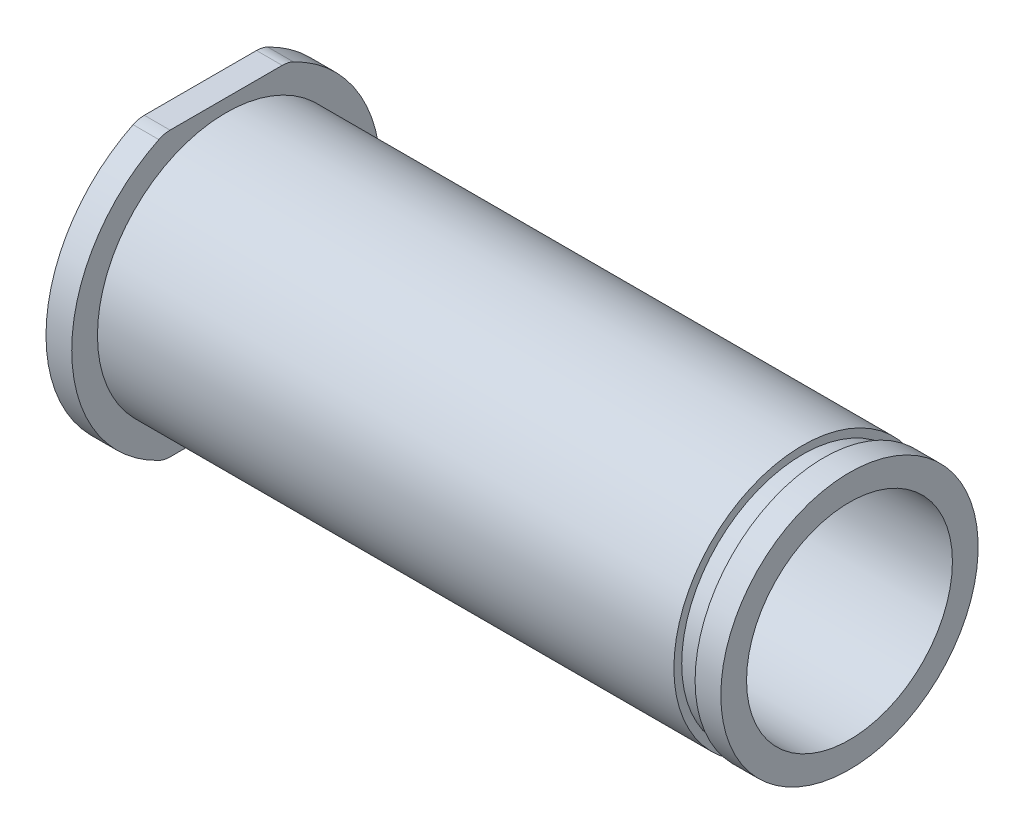
ISO-10303-21;
HEADER;
FILE_DESCRIPTION(('STEP AP214'),'2;1');
FILE_NAME('part.step','',(''),(''),'','','');
FILE_SCHEMA(('AUTOMOTIVE_DESIGN { 1 0 10303 214 1 1 1 1 }'));
ENDSEC;
DATA;
#1=APPLICATION_CONTEXT('core data for automotive mechanical design processes');
#2=APPLICATION_PROTOCOL_DEFINITION('international standard','automotive_design',2000,#1);
#3=PRODUCT_CONTEXT('',#1,'mechanical');
#4=PRODUCT('Part','Part','',(#3));
#5=PRODUCT_RELATED_PRODUCT_CATEGORY('part','',(#4));
#6=PRODUCT_DEFINITION_FORMATION('','',#4);
#7=PRODUCT_DEFINITION_CONTEXT('part definition',#1,'design');
#8=PRODUCT_DEFINITION('design','',#6,#7);
#9=PRODUCT_DEFINITION_SHAPE('','',#8);
#10=(LENGTH_UNIT() NAMED_UNIT(*) SI_UNIT(.MILLI.,.METRE.));
#11=(NAMED_UNIT(*) PLANE_ANGLE_UNIT() SI_UNIT($,.RADIAN.));
#12=(NAMED_UNIT(*) SI_UNIT($,.STERADIAN.) SOLID_ANGLE_UNIT());
#13=UNCERTAINTY_MEASURE_WITH_UNIT(LENGTH_MEASURE(1.E-05),#10,'distance_accuracy_value','');
#14=(GEOMETRIC_REPRESENTATION_CONTEXT(3) GLOBAL_UNCERTAINTY_ASSIGNED_CONTEXT((#13)) GLOBAL_UNIT_ASSIGNED_CONTEXT((#10,
#11,#12)) REPRESENTATION_CONTEXT('',''));
#15=CARTESIAN_POINT('',(0.,0.,0.));
#16=DIRECTION('',(0.,0.,1.));
#17=DIRECTION('',(1.,0.,0.));
#18=AXIS2_PLACEMENT_3D('',#15,#16,#17);
#19=CARTESIAN_POINT('',(0.,0.,0.));
#20=DIRECTION('',(-1.,0.,0.));
#21=DIRECTION('',(0.,0.,1.));
#22=AXIS2_PLACEMENT_3D('',#19,#20,#21);
#23=CYLINDRICAL_SURFACE('',#22,19.05);
#24=CARTESIAN_POINT('',(0.,0.,0.));
#25=DIRECTION('',(-1.,0.,0.));
#26=DIRECTION('',(0.,0.,1.));
#27=AXIS2_PLACEMENT_3D('',#24,#25,#26);
#28=CIRCLE('',#27,19.05);
#29=CARTESIAN_POINT('',(0.,-17.145,8.303702487445));
#30=VERTEX_POINT('',#29);
#31=CARTESIAN_POINT('',(0.,17.145,8.303702487445));
#32=VERTEX_POINT('',#31);
#33=EDGE_CURVE('E175',#30,#32,#28,.T.);
#34=ORIENTED_EDGE('',*,*,#33,.F.);
#35=DIRECTION('',(-1.,0.,0.));
#36=VECTOR('',#35,1.);
#37=CARTESIAN_POINT('',(0.,-17.145,8.303702487445));
#38=LINE('',#37,#36);
#39=CARTESIAN_POINT('',(3.175,-17.145,8.303702487445));
#40=VERTEX_POINT('',#39);
#41=EDGE_CURVE('E136',#30,#40,#38,.F.);
#42=ORIENTED_EDGE('',*,*,#41,.T.);
#43=CARTESIAN_POINT('',(3.175,0.,0.));
#44=DIRECTION('',(-1.,0.,0.));
#45=DIRECTION('',(0.,0.,1.));
#46=AXIS2_PLACEMENT_3D('',#43,#44,#45);
#47=CIRCLE('',#46,19.05);
#48=CARTESIAN_POINT('',(3.175,17.145,8.303702487445));
#49=VERTEX_POINT('',#48);
#50=EDGE_CURVE('E118',#40,#49,#47,.T.);
#51=ORIENTED_EDGE('',*,*,#50,.T.);
#52=DIRECTION('',(-1.,0.,0.));
#53=VECTOR('',#52,1.);
#54=CARTESIAN_POINT('',(0.,17.145,8.303702487445));
#55=LINE('',#54,#53);
#56=EDGE_CURVE('E133',#49,#32,#55,.T.);
#57=ORIENTED_EDGE('',*,*,#56,.T.);
#58=EDGE_LOOP('',(#34,#42,#51,#57));
#59=FACE_BOUND('',#58,.T.);
#60=ADVANCED_FACE('F35',(#59),#23,.T.);
#61=CARTESIAN_POINT('',(3.175,17.145,-8.303702487445));
#62=VERTEX_POINT('',#61);
#63=CARTESIAN_POINT('',(3.175,-17.145,-8.303702487445));
#64=VERTEX_POINT('',#63);
#65=EDGE_CURVE('E104',#62,#64,#47,.T.);
#66=ORIENTED_EDGE('',*,*,#65,.T.);
#67=DIRECTION('',(-1.,0.,0.));
#68=VECTOR('',#67,1.);
#69=CARTESIAN_POINT('',(0.,-17.145,-8.303702487445));
#70=LINE('',#69,#68);
#71=CARTESIAN_POINT('',(0.,-17.145,-8.303702487445));
#72=VERTEX_POINT('',#71);
#73=EDGE_CURVE('E109',#64,#72,#70,.T.);
#74=ORIENTED_EDGE('',*,*,#73,.T.);
#75=CARTESIAN_POINT('',(0.,17.145,-8.303702487445));
#76=VERTEX_POINT('',#75);
#77=EDGE_CURVE('E107',#76,#72,#28,.T.);
#78=ORIENTED_EDGE('',*,*,#77,.F.);
#79=DIRECTION('',(-1.,0.,0.));
#80=VECTOR('',#79,1.);
#81=CARTESIAN_POINT('',(0.,17.145,-8.303702487445));
#82=LINE('',#81,#80);
#83=EDGE_CURVE('E101',#76,#62,#82,.F.);
#84=ORIENTED_EDGE('',*,*,#83,.T.);
#85=EDGE_LOOP('',(#66,#74,#78,#84));
#86=FACE_BOUND('',#85,.T.);
#87=ADVANCED_FACE('F102',(#86),#23,.T.);
#88=CARTESIAN_POINT('',(0.,19.05,0.));
#89=DIRECTION('',(1.,0.,0.));
#90=DIRECTION('',(0.,0.,-1.));
#91=AXIS2_PLACEMENT_3D('',#88,#89,#90);
#92=PLANE('',#91);
#93=CARTESIAN_POINT('',(0.,0.,0.));
#94=DIRECTION('',(-1.,0.,0.));
#95=DIRECTION('',(0.,0.,1.));
#96=AXIS2_PLACEMENT_3D('',#93,#94,#95);
#97=CIRCLE('',#96,12.7);
#98=CARTESIAN_POINT('',(0.,0.,12.7));
#99=VERTEX_POINT('',#98);
#100=EDGE_CURVE('E172',#99,#99,#97,.T.);
#101=ORIENTED_EDGE('',*,*,#100,.F.);
#102=EDGE_LOOP('',(#101));
#103=FACE_BOUND('',#102,.T.);
#104=ORIENTED_EDGE('',*,*,#77,.T.);
#105=CARTESIAN_POINT('',(0.,-14.2875,-6.91975207287083));
#106=DIRECTION('',(1.,0.,0.));
#107=DIRECTION('',(0.,0.,-1.));
#108=AXIS2_PLACEMENT_3D('',#105,#106,#107);
#109=CIRCLE('',#108,3.175);
#110=CARTESIAN_POINT('',(0.,-17.4625,-6.91975207287083));
#111=VERTEX_POINT('',#110);
#112=EDGE_CURVE('E184',#72,#111,#109,.F.);
#113=ORIENTED_EDGE('',*,*,#112,.T.);
#114=DIRECTION('',(0.,0.,-1.));
#115=VECTOR('',#114,1.);
#116=CARTESIAN_POINT('',(0.,-17.4625,-7.61338254325895));
#117=LINE('',#116,#115);
#118=CARTESIAN_POINT('',(0.,-17.4625,6.91975207287083));
#119=VERTEX_POINT('',#118);
#120=EDGE_CURVE('E146',#119,#111,#117,.T.);
#121=ORIENTED_EDGE('',*,*,#120,.F.);
#122=CARTESIAN_POINT('',(0.,-14.2875,6.91975207287083));
#123=DIRECTION('',(1.,0.,0.));
#124=DIRECTION('',(0.,0.,-1.));
#125=AXIS2_PLACEMENT_3D('',#122,#123,#124);
#126=CIRCLE('',#125,3.175);
#127=EDGE_CURVE('E182',#119,#30,#126,.F.);
#128=ORIENTED_EDGE('',*,*,#127,.T.);
#129=ORIENTED_EDGE('',*,*,#33,.T.);
#130=CARTESIAN_POINT('',(0.,14.2875,6.91975207287083));
#131=DIRECTION('',(1.,0.,0.));
#132=DIRECTION('',(0.,0.,-1.));
#133=AXIS2_PLACEMENT_3D('',#130,#131,#132);
#134=CIRCLE('',#133,3.175);
#135=CARTESIAN_POINT('',(0.,17.4625,6.91975207287083));
#136=VERTEX_POINT('',#135);
#137=EDGE_CURVE('E145',#32,#136,#134,.F.);
#138=ORIENTED_EDGE('',*,*,#137,.T.);
#139=DIRECTION('',(0.,0.,1.));
#140=VECTOR('',#139,1.);
#141=CARTESIAN_POINT('',(0.,17.4625,-7.61338254325895));
#142=LINE('',#141,#140);
#143=CARTESIAN_POINT('',(0.,17.4625,-6.91975207287083));
#144=VERTEX_POINT('',#143);
#145=EDGE_CURVE('E139',#144,#136,#142,.T.);
#146=ORIENTED_EDGE('',*,*,#145,.F.);
#147=CARTESIAN_POINT('',(0.,14.2875,-6.91975207287083));
#148=DIRECTION('',(1.,0.,0.));
#149=DIRECTION('',(0.,0.,-1.));
#150=AXIS2_PLACEMENT_3D('',#147,#148,#149);
#151=CIRCLE('',#150,3.175);
#152=EDGE_CURVE('E143',#144,#76,#151,.F.);
#153=ORIENTED_EDGE('',*,*,#152,.T.);
#154=EDGE_LOOP('',(#104,#113,#121,#128,#129,#138,#146,#153));
#155=FACE_BOUND('',#154,.T.);
#156=ADVANCED_FACE('F142',(#103,#155),#92,.F.);
#157=CARTESIAN_POINT('',(0.,0.,0.));
#158=DIRECTION('',(-1.,0.,0.));
#159=DIRECTION('',(0.,0.,1.));
#160=AXIS2_PLACEMENT_3D('',#157,#158,#159);
#161=CYLINDRICAL_SURFACE('',#160,12.7);
#162=CARTESIAN_POINT('',(80.0862,0.,0.));
#163=DIRECTION('',(-1.,0.,0.));
#164=DIRECTION('',(0.,0.,1.));
#165=AXIS2_PLACEMENT_3D('',#162,#163,#164);
#166=CIRCLE('',#165,12.7);
#167=CARTESIAN_POINT('',(80.0862,0.,12.7));
#168=VERTEX_POINT('',#167);
#169=EDGE_CURVE('E169',#168,#168,#166,.T.);
#170=ORIENTED_EDGE('',*,*,#169,.F.);
#171=EDGE_LOOP('',(#170));
#172=FACE_BOUND('',#171,.T.);
#173=ORIENTED_EDGE('',*,*,#100,.T.);
#174=EDGE_LOOP('',(#173));
#175=FACE_BOUND('',#174,.T.);
#176=ADVANCED_FACE('F253',(#172,#175),#161,.F.);
#177=CARTESIAN_POINT('',(80.0862,12.7,0.));
#178=DIRECTION('',(-1.,0.,0.));
#179=DIRECTION('',(0.,0.,1.));
#180=AXIS2_PLACEMENT_3D('',#177,#178,#179);
#181=PLANE('',#180);
#182=CARTESIAN_POINT('',(80.0862,0.,0.));
#183=DIRECTION('',(-1.,0.,0.));
#184=DIRECTION('',(0.,0.,1.));
#185=AXIS2_PLACEMENT_3D('',#182,#183,#184);
#186=CIRCLE('',#185,15.875);
#187=CARTESIAN_POINT('',(80.0862,0.,15.875));
#188=VERTEX_POINT('',#187);
#189=EDGE_CURVE('E166',#188,#188,#186,.T.);
#190=ORIENTED_EDGE('',*,*,#189,.F.);
#191=EDGE_LOOP('',(#190));
#192=FACE_BOUND('',#191,.T.);
#193=ORIENTED_EDGE('',*,*,#169,.T.);
#194=EDGE_LOOP('',(#193));
#195=FACE_BOUND('',#194,.T.);
#196=ADVANCED_FACE('F250',(#192,#195),#181,.F.);
#197=CARTESIAN_POINT('',(0.,0.,0.));
#198=DIRECTION('',(-1.,0.,0.));
#199=DIRECTION('',(0.,0.,1.));
#200=AXIS2_PLACEMENT_3D('',#197,#198,#199);
#201=CYLINDRICAL_SURFACE('',#200,15.875);
#202=CARTESIAN_POINT('',(76.9112,0.,0.));
#203=DIRECTION('',(-1.,0.,0.));
#204=DIRECTION('',(0.,0.,1.));
#205=AXIS2_PLACEMENT_3D('',#202,#203,#204);
#206=CIRCLE('',#205,15.875);
#207=CARTESIAN_POINT('',(76.9112,0.,15.875));
#208=VERTEX_POINT('',#207);
#209=EDGE_CURVE('E163',#208,#208,#206,.T.);
#210=ORIENTED_EDGE('',*,*,#209,.F.);
#211=EDGE_LOOP('',(#210));
#212=FACE_BOUND('',#211,.T.);
#213=ORIENTED_EDGE('',*,*,#189,.T.);
#214=EDGE_LOOP('',(#213));
#215=FACE_BOUND('',#214,.T.);
#216=ADVANCED_FACE('F246',(#212,#215),#201,.T.);
#217=CARTESIAN_POINT('',(76.9112,15.875,0.));
#218=DIRECTION('',(1.,0.,0.));
#219=DIRECTION('',(0.,0.,-1.));
#220=AXIS2_PLACEMENT_3D('',#217,#218,#219);
#221=PLANE('',#220);
#222=CARTESIAN_POINT('',(76.9112,0.,0.));
#223=DIRECTION('',(-1.,0.,0.));
#224=DIRECTION('',(0.,0.,1.));
#225=AXIS2_PLACEMENT_3D('',#222,#223,#224);
#226=CIRCLE('',#225,14.9098);
#227=CARTESIAN_POINT('',(76.9112,0.,14.9098));
#228=VERTEX_POINT('',#227);
#229=EDGE_CURVE('E160',#228,#228,#226,.T.);
#230=ORIENTED_EDGE('',*,*,#229,.F.);
#231=EDGE_LOOP('',(#230));
#232=FACE_BOUND('',#231,.T.);
#233=ORIENTED_EDGE('',*,*,#209,.T.);
#234=EDGE_LOOP('',(#233));
#235=FACE_BOUND('',#234,.T.);
#236=ADVANCED_FACE('F242',(#232,#235),#221,.F.);
#237=CARTESIAN_POINT('',(0.,0.,0.));
#238=DIRECTION('',(-1.,0.,0.));
#239=DIRECTION('',(0.,0.,1.));
#240=AXIS2_PLACEMENT_3D('',#237,#238,#239);
#241=CYLINDRICAL_SURFACE('',#240,14.9098);
#242=CARTESIAN_POINT('',(74.295,0.,0.));
#243=DIRECTION('',(-1.,0.,0.));
#244=DIRECTION('',(0.,0.,1.));
#245=AXIS2_PLACEMENT_3D('',#242,#243,#244);
#246=CIRCLE('',#245,14.9098);
#247=CARTESIAN_POINT('',(74.295,0.,14.9098));
#248=VERTEX_POINT('',#247);
#249=EDGE_CURVE('E157',#248,#248,#246,.T.);
#250=ORIENTED_EDGE('',*,*,#249,.F.);
#251=EDGE_LOOP('',(#250));
#252=FACE_BOUND('',#251,.T.);
#253=ORIENTED_EDGE('',*,*,#229,.T.);
#254=EDGE_LOOP('',(#253));
#255=FACE_BOUND('',#254,.T.);
#256=ADVANCED_FACE('F238',(#252,#255),#241,.T.);
#257=CARTESIAN_POINT('',(74.295,14.9098,0.));
#258=DIRECTION('',(-1.,0.,0.));
#259=DIRECTION('',(0.,0.,1.));
#260=AXIS2_PLACEMENT_3D('',#257,#258,#259);
#261=PLANE('',#260);
#262=CARTESIAN_POINT('',(74.295,0.,0.));
#263=DIRECTION('',(-1.,0.,0.));
#264=DIRECTION('',(0.,0.,1.));
#265=AXIS2_PLACEMENT_3D('',#262,#263,#264);
#266=CIRCLE('',#265,15.875);
#267=CARTESIAN_POINT('',(74.295,0.,15.875));
#268=VERTEX_POINT('',#267);
#269=EDGE_CURVE('E154',#268,#268,#266,.T.);
#270=ORIENTED_EDGE('',*,*,#269,.F.);
#271=EDGE_LOOP('',(#270));
#272=FACE_BOUND('',#271,.T.);
#273=ORIENTED_EDGE('',*,*,#249,.T.);
#274=EDGE_LOOP('',(#273));
#275=FACE_BOUND('',#274,.T.);
#276=ADVANCED_FACE('F234',(#272,#275),#261,.F.);
#277=CARTESIAN_POINT('',(0.,0.,0.));
#278=DIRECTION('',(-1.,0.,0.));
#279=DIRECTION('',(0.,0.,1.));
#280=AXIS2_PLACEMENT_3D('',#277,#278,#279);
#281=CYLINDRICAL_SURFACE('',#280,15.875);
#282=CARTESIAN_POINT('',(3.175,0.,0.));
#283=DIRECTION('',(-1.,0.,0.));
#284=DIRECTION('',(0.,0.,1.));
#285=AXIS2_PLACEMENT_3D('',#282,#283,#284);
#286=CIRCLE('',#285,15.875);
#287=CARTESIAN_POINT('',(3.175,0.,15.875));
#288=VERTEX_POINT('',#287);
#289=EDGE_CURVE('E117',#288,#288,#286,.T.);
#290=ORIENTED_EDGE('',*,*,#289,.F.);
#291=EDGE_LOOP('',(#290));
#292=FACE_BOUND('',#291,.T.);
#293=ORIENTED_EDGE('',*,*,#269,.T.);
#294=EDGE_LOOP('',(#293));
#295=FACE_BOUND('',#294,.T.);
#296=ADVANCED_FACE('F231',(#292,#295),#281,.T.);
#297=CARTESIAN_POINT('',(3.175,15.875,0.));
#298=DIRECTION('',(-1.,0.,0.));
#299=DIRECTION('',(0.,0.,1.));
#300=AXIS2_PLACEMENT_3D('',#297,#298,#299);
#301=PLANE('',#300);
#302=DIRECTION('',(0.,0.,-1.));
#303=VECTOR('',#302,1.);
#304=CARTESIAN_POINT('',(3.175,-17.4625,0.));
#305=LINE('',#304,#303);
#306=CARTESIAN_POINT('',(3.175,-17.4625,6.91975207287083));
#307=VERTEX_POINT('',#306);
#308=CARTESIAN_POINT('',(3.175,-17.4625,-6.91975207287083));
#309=VERTEX_POINT('',#308);
#310=EDGE_CURVE('E110',#307,#309,#305,.T.);
#311=ORIENTED_EDGE('',*,*,#310,.T.);
#312=CARTESIAN_POINT('',(3.175,-14.2875,-6.91975207287083));
#313=DIRECTION('',(-1.,0.,0.));
#314=DIRECTION('',(0.,0.,1.));
#315=AXIS2_PLACEMENT_3D('',#312,#313,#314);
#316=CIRCLE('',#315,3.175);
#317=EDGE_CURVE('E116',#309,#64,#316,.F.);
#318=ORIENTED_EDGE('',*,*,#317,.T.);
#319=ORIENTED_EDGE('',*,*,#65,.F.);
#320=CARTESIAN_POINT('',(3.175,14.2875,-6.91975207287083));
#321=DIRECTION('',(-1.,0.,0.));
#322=DIRECTION('',(0.,0.,1.));
#323=AXIS2_PLACEMENT_3D('',#320,#321,#322);
#324=CIRCLE('',#323,3.175);
#325=CARTESIAN_POINT('',(3.175,17.4625,-6.91975207287083));
#326=VERTEX_POINT('',#325);
#327=EDGE_CURVE('E55',#62,#326,#324,.F.);
#328=ORIENTED_EDGE('',*,*,#327,.T.);
#329=DIRECTION('',(0.,0.,1.));
#330=VECTOR('',#329,1.);
#331=CARTESIAN_POINT('',(3.175,17.4625,0.));
#332=LINE('',#331,#330);
#333=CARTESIAN_POINT('',(3.175,17.4625,6.91975207287083));
#334=VERTEX_POINT('',#333);
#335=EDGE_CURVE('E140',#326,#334,#332,.T.);
#336=ORIENTED_EDGE('',*,*,#335,.T.);
#337=CARTESIAN_POINT('',(3.175,14.2875,6.91975207287083));
#338=DIRECTION('',(-1.,0.,0.));
#339=DIRECTION('',(0.,0.,1.));
#340=AXIS2_PLACEMENT_3D('',#337,#338,#339);
#341=CIRCLE('',#340,3.175);
#342=EDGE_CURVE('E122',#334,#49,#341,.F.);
#343=ORIENTED_EDGE('',*,*,#342,.T.);
#344=ORIENTED_EDGE('',*,*,#50,.F.);
#345=CARTESIAN_POINT('',(3.175,-14.2875,6.91975207287083));
#346=DIRECTION('',(-1.,0.,0.));
#347=DIRECTION('',(0.,0.,1.));
#348=AXIS2_PLACEMENT_3D('',#345,#346,#347);
#349=CIRCLE('',#348,3.175);
#350=EDGE_CURVE('E125',#40,#307,#349,.F.);
#351=ORIENTED_EDGE('',*,*,#350,.T.);
#352=EDGE_LOOP('',(#311,#318,#319,#328,#336,#343,#344,#351));
#353=FACE_BOUND('',#352,.T.);
#354=ORIENTED_EDGE('',*,*,#289,.T.);
#355=EDGE_LOOP('',(#354));
#356=FACE_BOUND('',#355,.T.);
#357=ADVANCED_FACE('F113',(#353,#356),#301,.F.);
#358=CARTESIAN_POINT('',(80.0862,17.4625,-7.61338254325895));
#359=DIRECTION('',(0.,-1.,0.));
#360=DIRECTION('',(0.,0.,-1.));
#361=AXIS2_PLACEMENT_3D('',#358,#359,#360);
#362=PLANE('',#361);
#363=ORIENTED_EDGE('',*,*,#145,.T.);
#364=DIRECTION('',(-1.,0.,0.));
#365=VECTOR('',#364,1.);
#366=CARTESIAN_POINT('',(80.0862,17.4625,6.91975207287083));
#367=LINE('',#366,#365);
#368=EDGE_CURVE('E11',#136,#334,#367,.F.);
#369=ORIENTED_EDGE('',*,*,#368,.T.);
#370=ORIENTED_EDGE('',*,*,#335,.F.);
#371=DIRECTION('',(-1.,0.,0.));
#372=VECTOR('',#371,1.);
#373=CARTESIAN_POINT('',(80.0862,17.4625,-6.91975207287083));
#374=LINE('',#373,#372);
#375=EDGE_CURVE('E43',#326,#144,#374,.T.);
#376=ORIENTED_EDGE('',*,*,#375,.T.);
#377=EDGE_LOOP('',(#363,#369,#370,#376));
#378=FACE_BOUND('',#377,.T.);
#379=ADVANCED_FACE('F138',(#378),#362,.F.);
#380=CARTESIAN_POINT('',(80.0862,-17.4625,-7.61338254325895));
#381=DIRECTION('',(0.,1.,0.));
#382=DIRECTION('',(0.,0.,1.));
#383=AXIS2_PLACEMENT_3D('',#380,#381,#382);
#384=PLANE('',#383);
#385=ORIENTED_EDGE('',*,*,#120,.T.);
#386=DIRECTION('',(-1.,0.,0.));
#387=VECTOR('',#386,1.);
#388=CARTESIAN_POINT('',(80.0862,-17.4625,-6.91975207287083));
#389=LINE('',#388,#387);
#390=EDGE_CURVE('E123',#111,#309,#389,.F.);
#391=ORIENTED_EDGE('',*,*,#390,.T.);
#392=ORIENTED_EDGE('',*,*,#310,.F.);
#393=DIRECTION('',(-1.,0.,0.));
#394=VECTOR('',#393,1.);
#395=CARTESIAN_POINT('',(80.0862,-17.4625,6.91975207287083));
#396=LINE('',#395,#394);
#397=EDGE_CURVE('E127',#307,#119,#396,.T.);
#398=ORIENTED_EDGE('',*,*,#397,.T.);
#399=EDGE_LOOP('',(#385,#391,#392,#398));
#400=FACE_BOUND('',#399,.T.);
#401=ADVANCED_FACE('F190',(#400),#384,.F.);
#402=CARTESIAN_POINT('',(0.,-14.2875,-6.91975207287083));
#403=DIRECTION('',(-1.,0.,0.));
#404=DIRECTION('',(0.,0.,1.));
#405=AXIS2_PLACEMENT_3D('',#402,#403,#404);
#406=CYLINDRICAL_SURFACE('',#405,3.175);
#407=ORIENTED_EDGE('',*,*,#317,.F.);
#408=ORIENTED_EDGE('',*,*,#390,.F.);
#409=ORIENTED_EDGE('',*,*,#112,.F.);
#410=ORIENTED_EDGE('',*,*,#73,.F.);
#411=EDGE_LOOP('',(#407,#408,#409,#410));
#412=FACE_BOUND('',#411,.T.);
#413=ADVANCED_FACE('F196',(#412),#406,.T.);
#414=CARTESIAN_POINT('',(0.,-14.2875,6.91975207287083));
#415=DIRECTION('',(-1.,0.,0.));
#416=DIRECTION('',(0.,0.,1.));
#417=AXIS2_PLACEMENT_3D('',#414,#415,#416);
#418=CYLINDRICAL_SURFACE('',#417,3.175);
#419=ORIENTED_EDGE('',*,*,#350,.F.);
#420=ORIENTED_EDGE('',*,*,#41,.F.);
#421=ORIENTED_EDGE('',*,*,#127,.F.);
#422=ORIENTED_EDGE('',*,*,#397,.F.);
#423=EDGE_LOOP('',(#419,#420,#421,#422));
#424=FACE_BOUND('',#423,.T.);
#425=ADVANCED_FACE('F199',(#424),#418,.T.);
#426=CARTESIAN_POINT('',(0.,14.2875,6.91975207287083));
#427=DIRECTION('',(-1.,0.,0.));
#428=DIRECTION('',(0.,0.,1.));
#429=AXIS2_PLACEMENT_3D('',#426,#427,#428);
#430=CYLINDRICAL_SURFACE('',#429,3.175);
#431=ORIENTED_EDGE('',*,*,#342,.F.);
#432=ORIENTED_EDGE('',*,*,#368,.F.);
#433=ORIENTED_EDGE('',*,*,#137,.F.);
#434=ORIENTED_EDGE('',*,*,#56,.F.);
#435=EDGE_LOOP('',(#431,#432,#433,#434));
#436=FACE_BOUND('',#435,.T.);
#437=ADVANCED_FACE('F204',(#436),#430,.T.);
#438=CARTESIAN_POINT('',(0.,14.2875,-6.91975207287083));
#439=DIRECTION('',(-1.,0.,0.));
#440=DIRECTION('',(0.,0.,1.));
#441=AXIS2_PLACEMENT_3D('',#438,#439,#440);
#442=CYLINDRICAL_SURFACE('',#441,3.175);
#443=ORIENTED_EDGE('',*,*,#327,.F.);
#444=ORIENTED_EDGE('',*,*,#83,.F.);
#445=ORIENTED_EDGE('',*,*,#152,.F.);
#446=ORIENTED_EDGE('',*,*,#375,.F.);
#447=EDGE_LOOP('',(#443,#444,#445,#446));
#448=FACE_BOUND('',#447,.T.);
#449=ADVANCED_FACE('F37',(#448),#442,.T.);
#450=CLOSED_SHELL('',(#60,#87,#156,#176,#196,#216,#236,#256,#276,#296,#357,#379,#401,#413,#425,
#437,#449));
#451=MANIFOLD_SOLID_BREP('B2',#450);
#452=ADVANCED_BREP_SHAPE_REPRESENTATION('',(#18,#451),#14);
#453=SHAPE_DEFINITION_REPRESENTATION(#9,#452);
ENDSEC;
END-ISO-10303-21;
